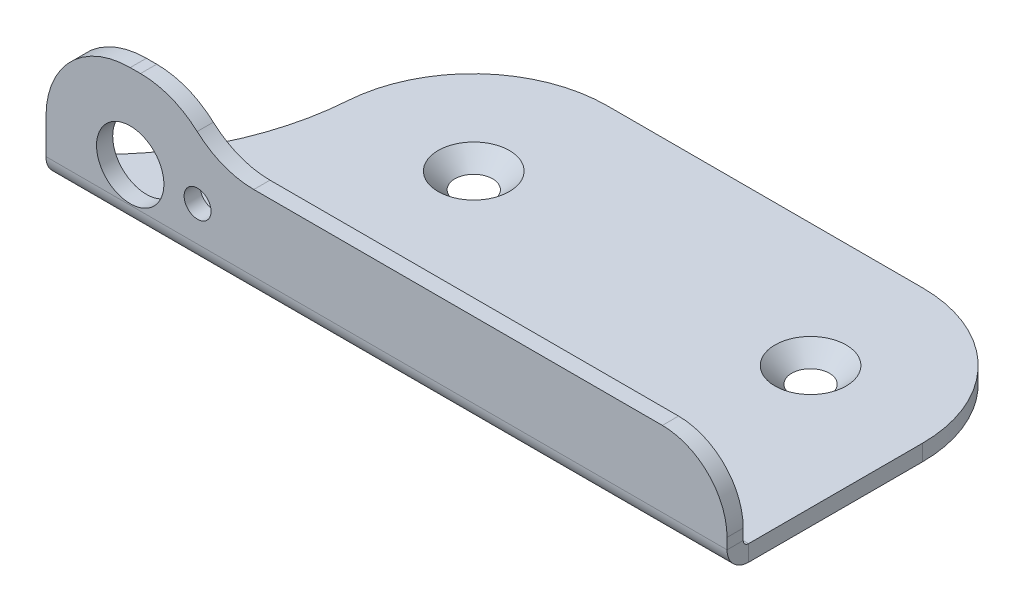
ISO-10303-21;
HEADER;
FILE_DESCRIPTION(('STEP AP214'),'2;1');
FILE_NAME('part.step','',(''),(''),'','','');
FILE_SCHEMA(('AUTOMOTIVE_DESIGN { 1 0 10303 214 1 1 1 1 }'));
ENDSEC;
DATA;
#1=APPLICATION_CONTEXT('core data for automotive mechanical design processes');
#2=APPLICATION_PROTOCOL_DEFINITION('international standard','automotive_design',2000,#1);
#3=PRODUCT_CONTEXT('',#1,'mechanical');
#4=PRODUCT('Part','Part','',(#3));
#5=PRODUCT_RELATED_PRODUCT_CATEGORY('part','',(#4));
#6=PRODUCT_DEFINITION_FORMATION('','',#4);
#7=PRODUCT_DEFINITION_CONTEXT('part definition',#1,'design');
#8=PRODUCT_DEFINITION('design','',#6,#7);
#9=PRODUCT_DEFINITION_SHAPE('','',#8);
#10=(LENGTH_UNIT() NAMED_UNIT(*) SI_UNIT(.MILLI.,.METRE.));
#11=(NAMED_UNIT(*) PLANE_ANGLE_UNIT() SI_UNIT($,.RADIAN.));
#12=(NAMED_UNIT(*) SI_UNIT($,.STERADIAN.) SOLID_ANGLE_UNIT());
#13=UNCERTAINTY_MEASURE_WITH_UNIT(LENGTH_MEASURE(1.E-05),#10,'distance_accuracy_value','');
#14=(GEOMETRIC_REPRESENTATION_CONTEXT(3) GLOBAL_UNCERTAINTY_ASSIGNED_CONTEXT((#13)) GLOBAL_UNIT_ASSIGNED_CONTEXT((#10,
#11,#12)) REPRESENTATION_CONTEXT('',''));
#15=CARTESIAN_POINT('',(0.,0.,0.));
#16=DIRECTION('',(0.,0.,1.));
#17=DIRECTION('',(1.,0.,0.));
#18=AXIS2_PLACEMENT_3D('',#15,#16,#17);
#19=CARTESIAN_POINT('',(-36.703,-1.524,19.4945));
#20=DIRECTION('',(-1.,0.,0.));
#21=DIRECTION('',(0.,1.,0.));
#22=AXIS2_PLACEMENT_3D('',#19,#20,#21);
#23=PLANE('',#22);
#24=CARTESIAN_POINT('',(-36.703,0.508,19.4945));
#25=CARTESIAN_POINT('',(-36.703,0.508,17.9705));
#26=B_SPLINE_CURVE_WITH_KNOTS('',1,(#24,#25),.UNSPECIFIED.,.F.,.F.,(2,2),(0.,1.),.UNSPECIFIED.);
#27=CARTESIAN_POINT('',(-36.703,0.508,17.9705));
#28=VERTEX_POINT('',#27);
#29=CARTESIAN_POINT('',(-36.703,0.507999999999999,19.4945));
#30=VERTEX_POINT('',#29);
#31=EDGE_CURVE('E11',#28,#30,#26,.F.);
#32=ORIENTED_EDGE('',*,*,#31,.T.);
#33=DIRECTION('',(0.,1.,0.));
#34=VECTOR('',#33,1.);
#35=CARTESIAN_POINT('',(-36.703,-1.524,19.4945));
#36=LINE('',#35,#34);
#37=CARTESIAN_POINT('',(-36.703,3.81,19.4945));
#38=VERTEX_POINT('',#37);
#39=EDGE_CURVE('E263',#30,#38,#36,.T.);
#40=ORIENTED_EDGE('',*,*,#39,.T.);
#41=DIRECTION('',(0.,0.,1.));
#42=VECTOR('',#41,1.);
#43=CARTESIAN_POINT('',(-36.703,3.81,19.4945));
#44=LINE('',#43,#42);
#45=CARTESIAN_POINT('',(-36.703,3.81,17.9705));
#46=VERTEX_POINT('',#45);
#47=EDGE_CURVE('E56',#46,#38,#44,.T.);
#48=ORIENTED_EDGE('',*,*,#47,.F.);
#49=DIRECTION('',(0.,1.,0.));
#50=VECTOR('',#49,1.);
#51=CARTESIAN_POINT('',(-36.703,-1.524,17.9705));
#52=LINE('',#51,#50);
#53=EDGE_CURVE('E128',#28,#46,#52,.T.);
#54=ORIENTED_EDGE('',*,*,#53,.F.);
#55=EDGE_LOOP('',(#32,#40,#48,#54));
#56=FACE_BOUND('',#55,.T.);
#57=ADVANCED_FACE('F45',(#56),#23,.T.);
#58=CARTESIAN_POINT('',(-28.7655,3.81,19.4945));
#59=DIRECTION('',(0.,0.,1.));
#60=DIRECTION('',(-1.,0.,0.));
#61=AXIS2_PLACEMENT_3D('',#58,#59,#60);
#62=CYLINDRICAL_SURFACE('',#61,7.9375);
#63=ORIENTED_EDGE('',*,*,#47,.T.);
#64=CARTESIAN_POINT('',(-28.7655,3.81,19.4945));
#65=DIRECTION('',(0.,0.,-1.));
#66=DIRECTION('',(-1.,0.,0.));
#67=AXIS2_PLACEMENT_3D('',#64,#65,#66);
#68=CIRCLE('',#67,7.9375);
#69=CARTESIAN_POINT('',(-28.7655,11.7475,19.4945));
#70=VERTEX_POINT('',#69);
#71=EDGE_CURVE('E260',#38,#70,#68,.T.);
#72=ORIENTED_EDGE('',*,*,#71,.T.);
#73=DIRECTION('',(0.,0.,1.));
#74=VECTOR('',#73,1.);
#75=CARTESIAN_POINT('',(-28.7655,11.7475,19.4945));
#76=LINE('',#75,#74);
#77=CARTESIAN_POINT('',(-28.7655,11.7475,17.9705));
#78=VERTEX_POINT('',#77);
#79=EDGE_CURVE('E246',#78,#70,#76,.T.);
#80=ORIENTED_EDGE('',*,*,#79,.F.);
#81=CARTESIAN_POINT('',(-28.7655,3.81,17.9705));
#82=DIRECTION('',(0.,0.,-1.));
#83=DIRECTION('',(-1.,0.,0.));
#84=AXIS2_PLACEMENT_3D('',#81,#82,#83);
#85=CIRCLE('',#84,7.9375);
#86=EDGE_CURVE('E159',#46,#78,#85,.T.);
#87=ORIENTED_EDGE('',*,*,#86,.F.);
#88=EDGE_LOOP('',(#63,#72,#80,#87));
#89=FACE_BOUND('',#88,.T.);
#90=ADVANCED_FACE('F258',(#89),#62,.T.);
#91=CARTESIAN_POINT('',(-36.703,11.7475,19.4945));
#92=DIRECTION('',(0.,-1.,0.));
#93=DIRECTION('',(-1.,0.,0.));
#94=AXIS2_PLACEMENT_3D('',#91,#92,#93);
#95=PLANE('',#94);
#96=ORIENTED_EDGE('',*,*,#79,.T.);
#97=DIRECTION('',(-1.,0.,0.));
#98=VECTOR('',#97,1.);
#99=CARTESIAN_POINT('',(-36.703,11.7475,19.4945));
#100=LINE('',#99,#98);
#101=CARTESIAN_POINT('',(-27.791318623329,11.7475,19.4945));
#102=VERTEX_POINT('',#101);
#103=EDGE_CURVE('E495',#102,#70,#100,.T.);
#104=ORIENTED_EDGE('',*,*,#103,.F.);
#105=DIRECTION('',(0.,0.,1.));
#106=VECTOR('',#105,1.);
#107=CARTESIAN_POINT('',(-27.791318623329,11.7475,19.4945));
#108=LINE('',#107,#106);
#109=CARTESIAN_POINT('',(-27.791318623329,11.7475,17.9705));
#110=VERTEX_POINT('',#109);
#111=EDGE_CURVE('E244',#110,#102,#108,.T.);
#112=ORIENTED_EDGE('',*,*,#111,.F.);
#113=DIRECTION('',(-1.,0.,0.));
#114=VECTOR('',#113,1.);
#115=CARTESIAN_POINT('',(27.4955,11.7475,17.9705));
#116=LINE('',#115,#114);
#117=EDGE_CURVE('E387',#110,#78,#116,.T.);
#118=ORIENTED_EDGE('',*,*,#117,.T.);
#119=EDGE_LOOP('',(#96,#104,#112,#118));
#120=FACE_BOUND('',#119,.T.);
#121=ADVANCED_FACE('F423',(#120),#95,.F.);
#122=CARTESIAN_POINT('',(-27.791318623329,3.81,19.4945));
#123=DIRECTION('',(0.,0.,1.));
#124=DIRECTION('',(-1.,0.,0.));
#125=AXIS2_PLACEMENT_3D('',#122,#123,#124);
#126=CYLINDRICAL_SURFACE('',#125,7.9375);
#127=ORIENTED_EDGE('',*,*,#111,.T.);
#128=CARTESIAN_POINT('',(-27.791318623329,3.81,19.4945));
#129=DIRECTION('',(0.,0.,-1.));
#130=DIRECTION('',(-1.,0.,0.));
#131=AXIS2_PLACEMENT_3D('',#128,#129,#130);
#132=CIRCLE('',#131,7.9375);
#133=CARTESIAN_POINT('',(-22.4525016019749,9.68375,19.4945));
#134=VERTEX_POINT('',#133);
#135=EDGE_CURVE('E503',#102,#134,#132,.T.);
#136=ORIENTED_EDGE('',*,*,#135,.T.);
#137=DIRECTION('',(0.,0.,1.));
#138=VECTOR('',#137,1.);
#139=CARTESIAN_POINT('',(-22.4525016019749,9.68375,19.4945));
#140=LINE('',#139,#138);
#141=CARTESIAN_POINT('',(-22.4525016019749,9.68374999999999,17.9705));
#142=VERTEX_POINT('',#141);
#143=EDGE_CURVE('E240',#142,#134,#140,.T.);
#144=ORIENTED_EDGE('',*,*,#143,.F.);
#145=CARTESIAN_POINT('',(-27.791318623329,3.81,17.9705));
#146=DIRECTION('',(0.,0.,-1.));
#147=DIRECTION('',(-1.,0.,0.));
#148=AXIS2_PLACEMENT_3D('',#145,#146,#147);
#149=CIRCLE('',#148,7.9375);
#150=EDGE_CURVE('E383',#110,#142,#149,.T.);
#151=ORIENTED_EDGE('',*,*,#150,.F.);
#152=EDGE_LOOP('',(#127,#136,#144,#151));
#153=FACE_BOUND('',#152,.T.);
#154=ADVANCED_FACE('F427',(#153),#126,.T.);
#155=CARTESIAN_POINT('',(-17.1136845806208,15.5575,19.4945));
#156=DIRECTION('',(0.,0.,1.));
#157=DIRECTION('',(-1.,0.,0.));
#158=AXIS2_PLACEMENT_3D('',#155,#156,#157);
#159=CYLINDRICAL_SURFACE('',#158,7.9375);
#160=ORIENTED_EDGE('',*,*,#143,.T.);
#161=CARTESIAN_POINT('',(-17.1136845806208,15.5575,19.4945));
#162=DIRECTION('',(0.,0.,-1.));
#163=DIRECTION('',(-1.,0.,0.));
#164=AXIS2_PLACEMENT_3D('',#161,#162,#163);
#165=CIRCLE('',#164,7.9375);
#166=CARTESIAN_POINT('',(-17.1136845806208,7.62,19.4945));
#167=VERTEX_POINT('',#166);
#168=EDGE_CURVE('E344',#134,#167,#165,.F.);
#169=ORIENTED_EDGE('',*,*,#168,.T.);
#170=DIRECTION('',(0.,0.,1.));
#171=VECTOR('',#170,1.);
#172=CARTESIAN_POINT('',(-17.1136845806208,7.62,19.4945));
#173=LINE('',#172,#171);
#174=CARTESIAN_POINT('',(-17.1136845806208,7.62,17.9705));
#175=VERTEX_POINT('',#174);
#176=EDGE_CURVE('E236',#175,#167,#173,.T.);
#177=ORIENTED_EDGE('',*,*,#176,.F.);
#178=CARTESIAN_POINT('',(-17.1136845806208,15.5575,17.9705));
#179=DIRECTION('',(0.,0.,-1.));
#180=DIRECTION('',(-1.,0.,0.));
#181=AXIS2_PLACEMENT_3D('',#178,#179,#180);
#182=CIRCLE('',#181,7.9375);
#183=EDGE_CURVE('E379',#142,#175,#182,.F.);
#184=ORIENTED_EDGE('',*,*,#183,.F.);
#185=EDGE_LOOP('',(#160,#169,#177,#184));
#186=FACE_BOUND('',#185,.T.);
#187=ADVANCED_FACE('F432',(#186),#159,.F.);
#188=CARTESIAN_POINT('',(27.4955,7.62,19.4945));
#189=DIRECTION('',(0.,-1.,0.));
#190=DIRECTION('',(-1.,0.,0.));
#191=AXIS2_PLACEMENT_3D('',#188,#189,#190);
#192=PLANE('',#191);
#193=ORIENTED_EDGE('',*,*,#176,.T.);
#194=DIRECTION('',(-1.,0.,0.));
#195=VECTOR('',#194,1.);
#196=CARTESIAN_POINT('',(27.4955,7.62,19.4945));
#197=LINE('',#196,#195);
#198=CARTESIAN_POINT('',(21.3995,7.62,19.4945));
#199=VERTEX_POINT('',#198);
#200=EDGE_CURVE('E341',#199,#167,#197,.T.);
#201=ORIENTED_EDGE('',*,*,#200,.F.);
#202=DIRECTION('',(0.,0.,1.));
#203=VECTOR('',#202,1.);
#204=CARTESIAN_POINT('',(21.3995,7.62,19.4945));
#205=LINE('',#204,#203);
#206=CARTESIAN_POINT('',(21.3995,7.62,17.9705));
#207=VERTEX_POINT('',#206);
#208=EDGE_CURVE('E233',#207,#199,#205,.T.);
#209=ORIENTED_EDGE('',*,*,#208,.F.);
#210=DIRECTION('',(-1.,0.,0.));
#211=VECTOR('',#210,1.);
#212=CARTESIAN_POINT('',(27.4955,7.62,17.9705));
#213=LINE('',#212,#211);
#214=EDGE_CURVE('E376',#207,#175,#213,.T.);
#215=ORIENTED_EDGE('',*,*,#214,.T.);
#216=EDGE_LOOP('',(#193,#201,#209,#215));
#217=FACE_BOUND('',#216,.T.);
#218=ADVANCED_FACE('F436',(#217),#192,.F.);
#219=CARTESIAN_POINT('',(21.3995,1.524,19.4945));
#220=DIRECTION('',(0.,0.,1.));
#221=DIRECTION('',(-1.,0.,0.));
#222=AXIS2_PLACEMENT_3D('',#219,#220,#221);
#223=CYLINDRICAL_SURFACE('',#222,6.096);
#224=ORIENTED_EDGE('',*,*,#208,.T.);
#225=CARTESIAN_POINT('',(21.3995,1.524,19.4945));
#226=DIRECTION('',(0.,0.,-1.));
#227=DIRECTION('',(-1.,0.,0.));
#228=AXIS2_PLACEMENT_3D('',#225,#226,#227);
#229=CIRCLE('',#228,6.096);
#230=CARTESIAN_POINT('',(27.4955,1.524,19.4945));
#231=VERTEX_POINT('',#230);
#232=EDGE_CURVE('E273',#199,#231,#229,.T.);
#233=ORIENTED_EDGE('',*,*,#232,.T.);
#234=DIRECTION('',(0.,0.,1.));
#235=VECTOR('',#234,1.);
#236=CARTESIAN_POINT('',(27.4955,1.524,19.4945));
#237=LINE('',#236,#235);
#238=CARTESIAN_POINT('',(27.4955,1.524,17.9705));
#239=VERTEX_POINT('',#238);
#240=EDGE_CURVE('E230',#239,#231,#237,.T.);
#241=ORIENTED_EDGE('',*,*,#240,.F.);
#242=CARTESIAN_POINT('',(21.3995,1.524,17.9705));
#243=DIRECTION('',(0.,0.,-1.));
#244=DIRECTION('',(-1.,0.,0.));
#245=AXIS2_PLACEMENT_3D('',#242,#243,#244);
#246=CIRCLE('',#245,6.096);
#247=EDGE_CURVE('E374',#207,#239,#246,.T.);
#248=ORIENTED_EDGE('',*,*,#247,.F.);
#249=EDGE_LOOP('',(#224,#233,#241,#248));
#250=FACE_BOUND('',#249,.T.);
#251=ADVANCED_FACE('F338',(#250),#223,.T.);
#252=CARTESIAN_POINT('',(27.4955,-1.524,19.4945));
#253=DIRECTION('',(-1.,0.,0.));
#254=DIRECTION('',(0.,1.,0.));
#255=AXIS2_PLACEMENT_3D('',#252,#253,#254);
#256=PLANE('',#255);
#257=ORIENTED_EDGE('',*,*,#240,.T.);
#258=DIRECTION('',(0.,1.,0.));
#259=VECTOR('',#258,1.);
#260=CARTESIAN_POINT('',(27.4955,-1.524,19.4945));
#261=LINE('',#260,#259);
#262=CARTESIAN_POINT('',(27.4955,0.507999999999999,19.4945));
#263=VERTEX_POINT('',#262);
#264=EDGE_CURVE('E267',#263,#231,#261,.T.);
#265=ORIENTED_EDGE('',*,*,#264,.F.);
#266=DIRECTION('',(0.,0.,1.));
#267=VECTOR('',#266,1.);
#268=CARTESIAN_POINT('',(27.4955,0.507999999999999,19.4945));
#269=LINE('',#268,#267);
#270=CARTESIAN_POINT('',(27.4955,0.507999999999998,17.9705));
#271=VERTEX_POINT('',#270);
#272=EDGE_CURVE('E227',#271,#263,#269,.T.);
#273=ORIENTED_EDGE('',*,*,#272,.F.);
#274=DIRECTION('',(0.,1.,0.));
#275=VECTOR('',#274,1.);
#276=CARTESIAN_POINT('',(27.4955,-1.524,17.9705));
#277=LINE('',#276,#275);
#278=EDGE_CURVE('E131',#271,#239,#277,.T.);
#279=ORIENTED_EDGE('',*,*,#278,.T.);
#280=EDGE_LOOP('',(#257,#265,#273,#279));
#281=FACE_BOUND('',#280,.T.);
#282=ADVANCED_FACE('F336',(#281),#256,.F.);
#283=CARTESIAN_POINT('',(27.4955,0.508,17.4625));
#284=DIRECTION('',(-1.,0.,0.));
#285=DIRECTION('',(0.,0.,-1.));
#286=AXIS2_PLACEMENT_3D('',#283,#284,#285);
#287=PLANE('',#286);
#288=ORIENTED_EDGE('',*,*,#272,.T.);
#289=CARTESIAN_POINT('',(27.4955,0.508,17.4625));
#290=DIRECTION('',(-1.,0.,0.));
#291=DIRECTION('',(0.,0.,1.));
#292=AXIS2_PLACEMENT_3D('',#289,#290,#291);
#293=CIRCLE('',#292,2.032);
#294=CARTESIAN_POINT('',(27.4955,-1.524,17.4625));
#295=VERTEX_POINT('',#294);
#296=EDGE_CURVE('E326',#263,#295,#293,.F.);
#297=ORIENTED_EDGE('',*,*,#296,.T.);
#298=DIRECTION('',(0.,-1.,0.));
#299=VECTOR('',#298,1.);
#300=CARTESIAN_POINT('',(27.4955,-1.524,17.4625));
#301=LINE('',#300,#299);
#302=CARTESIAN_POINT('',(27.4955,0.,17.4625));
#303=VERTEX_POINT('',#302);
#304=EDGE_CURVE('E224',#303,#295,#301,.T.);
#305=ORIENTED_EDGE('',*,*,#304,.F.);
#306=CARTESIAN_POINT('',(27.4955,0.508,17.4625));
#307=DIRECTION('',(-1.,0.,0.));
#308=DIRECTION('',(0.,0.,1.));
#309=AXIS2_PLACEMENT_3D('',#306,#307,#308);
#310=CIRCLE('',#309,0.508);
#311=EDGE_CURVE('E151',#271,#303,#310,.F.);
#312=ORIENTED_EDGE('',*,*,#311,.F.);
#313=EDGE_LOOP('',(#288,#297,#305,#312));
#314=FACE_BOUND('',#313,.T.);
#315=ADVANCED_FACE('F445',(#314),#287,.F.);
#316=CARTESIAN_POINT('',(27.4955,-1.524,-11.6205));
#317=DIRECTION('',(1.,0.,0.));
#318=DIRECTION('',(0.,0.,1.));
#319=AXIS2_PLACEMENT_3D('',#316,#317,#318);
#320=PLANE('',#319);
#321=ORIENTED_EDGE('',*,*,#304,.T.);
#322=DIRECTION('',(0.,0.,1.));
#323=VECTOR('',#322,1.);
#324=CARTESIAN_POINT('',(27.4955,-1.524,-11.6205));
#325=LINE('',#324,#323);
#326=CARTESIAN_POINT('',(27.4955,-1.524,1.0795));
#327=VERTEX_POINT('',#326);
#328=EDGE_CURVE('E270',#327,#295,#325,.T.);
#329=ORIENTED_EDGE('',*,*,#328,.F.);
#330=DIRECTION('',(0.,-1.,0.));
#331=VECTOR('',#330,1.);
#332=CARTESIAN_POINT('',(27.4955,-1.524,1.0795));
#333=LINE('',#332,#331);
#334=CARTESIAN_POINT('',(27.4955,0.,1.0795));
#335=VERTEX_POINT('',#334);
#336=EDGE_CURVE('E221',#335,#327,#333,.T.);
#337=ORIENTED_EDGE('',*,*,#336,.F.);
#338=DIRECTION('',(0.,0.,-1.));
#339=VECTOR('',#338,1.);
#340=CARTESIAN_POINT('',(27.4955,0.,0.));
#341=LINE('',#340,#339);
#342=EDGE_CURVE('E368',#335,#303,#341,.F.);
#343=ORIENTED_EDGE('',*,*,#342,.T.);
#344=EDGE_LOOP('',(#321,#329,#337,#343));
#345=FACE_BOUND('',#344,.T.);
#346=ADVANCED_FACE('F448',(#345),#320,.T.);
#347=CARTESIAN_POINT('',(14.7955,-1.524,1.0795));
#348=DIRECTION('',(0.,1.,0.));
#349=DIRECTION('',(0.,0.,-1.));
#350=AXIS2_PLACEMENT_3D('',#347,#348,#349);
#351=CYLINDRICAL_SURFACE('',#350,12.7);
#352=ORIENTED_EDGE('',*,*,#336,.T.);
#353=CARTESIAN_POINT('',(14.7955,-1.524,1.0795));
#354=DIRECTION('',(0.,-1.,0.));
#355=DIRECTION('',(0.,0.,-1.));
#356=AXIS2_PLACEMENT_3D('',#353,#354,#355);
#357=CIRCLE('',#356,12.7);
#358=CARTESIAN_POINT('',(14.7955,-1.524,-11.6205));
#359=VERTEX_POINT('',#358);
#360=EDGE_CURVE('E349',#327,#359,#357,.F.);
#361=ORIENTED_EDGE('',*,*,#360,.T.);
#362=DIRECTION('',(0.,-1.,0.));
#363=VECTOR('',#362,1.);
#364=CARTESIAN_POINT('',(14.7955,-1.524,-11.6205));
#365=LINE('',#364,#363);
#366=CARTESIAN_POINT('',(14.7955,0.,-11.6205));
#367=VERTEX_POINT('',#366);
#368=EDGE_CURVE('E218',#367,#359,#365,.T.);
#369=ORIENTED_EDGE('',*,*,#368,.F.);
#370=CARTESIAN_POINT('',(14.7955,0.,1.0795));
#371=DIRECTION('',(0.,-1.,0.));
#372=DIRECTION('',(0.,0.,-1.));
#373=AXIS2_PLACEMENT_3D('',#370,#371,#372);
#374=CIRCLE('',#373,12.7);
#375=EDGE_CURVE('E365',#335,#367,#374,.F.);
#376=ORIENTED_EDGE('',*,*,#375,.F.);
#377=EDGE_LOOP('',(#352,#361,#369,#376));
#378=FACE_BOUND('',#377,.T.);
#379=ADVANCED_FACE('F452',(#378),#351,.T.);
#380=CARTESIAN_POINT('',(-27.4955,-1.524,-11.6205));
#381=DIRECTION('',(0.,0.,-1.));
#382=DIRECTION('',(1.,0.,0.));
#383=AXIS2_PLACEMENT_3D('',#380,#381,#382);
#384=PLANE('',#383);
#385=ORIENTED_EDGE('',*,*,#368,.T.);
#386=DIRECTION('',(1.,0.,0.));
#387=VECTOR('',#386,1.);
#388=CARTESIAN_POINT('',(-27.4955,-1.524,-11.6205));
#389=LINE('',#388,#387);
#390=CARTESIAN_POINT('',(-14.8897640593582,-1.524,-11.6205));
#391=VERTEX_POINT('',#390);
#392=EDGE_CURVE('E352',#391,#359,#389,.T.);
#393=ORIENTED_EDGE('',*,*,#392,.F.);
#394=DIRECTION('',(0.,-1.,0.));
#395=VECTOR('',#394,1.);
#396=CARTESIAN_POINT('',(-14.8897640593582,-1.524,-11.6205));
#397=LINE('',#396,#395);
#398=CARTESIAN_POINT('',(-14.8897640593582,0.,-11.6205));
#399=VERTEX_POINT('',#398);
#400=EDGE_CURVE('E213',#399,#391,#397,.T.);
#401=ORIENTED_EDGE('',*,*,#400,.F.);
#402=DIRECTION('',(1.,0.,0.));
#403=VECTOR('',#402,1.);
#404=CARTESIAN_POINT('',(0.,0.,-11.6205));
#405=LINE('',#404,#403);
#406=EDGE_CURVE('E363',#399,#367,#405,.T.);
#407=ORIENTED_EDGE('',*,*,#406,.T.);
#408=EDGE_LOOP('',(#385,#393,#401,#407));
#409=FACE_BOUND('',#408,.T.);
#410=ADVANCED_FACE('F456',(#409),#384,.T.);
#411=CARTESIAN_POINT('',(-14.8897640593582,-1.524,1.0795));
#412=DIRECTION('',(0.,1.,0.));
#413=DIRECTION('',(0.,0.,-1.));
#414=AXIS2_PLACEMENT_3D('',#411,#412,#413);
#415=CYLINDRICAL_SURFACE('',#414,12.7);
#416=ORIENTED_EDGE('',*,*,#400,.T.);
#417=CARTESIAN_POINT('',(-14.8897640593582,-1.524,1.0795));
#418=DIRECTION('',(0.,-1.,0.));
#419=DIRECTION('',(0.,0.,-1.));
#420=AXIS2_PLACEMENT_3D('',#417,#418,#419);
#421=CIRCLE('',#420,12.7);
#422=CARTESIAN_POINT('',(-27.5583427062388,-1.524,0.18668699169386));
#423=VERTEX_POINT('',#422);
#424=EDGE_CURVE('E294',#391,#423,#421,.F.);
#425=ORIENTED_EDGE('',*,*,#424,.T.);
#426=DIRECTION('',(0.,-1.,0.));
#427=VECTOR('',#426,1.);
#428=CARTESIAN_POINT('',(-27.5583427062388,-1.524,0.18668699169386));
#429=LINE('',#428,#427);
#430=CARTESIAN_POINT('',(-27.5583427062388,0.,0.18668699169386));
#431=VERTEX_POINT('',#430);
#432=EDGE_CURVE('E204',#431,#423,#429,.T.);
#433=ORIENTED_EDGE('',*,*,#432,.F.);
#434=CARTESIAN_POINT('',(-14.8897640593582,0.,1.0795));
#435=DIRECTION('',(0.,-1.,0.));
#436=DIRECTION('',(0.,0.,-1.));
#437=AXIS2_PLACEMENT_3D('',#434,#435,#436);
#438=CIRCLE('',#437,12.7);
#439=EDGE_CURVE('E359',#399,#431,#438,.F.);
#440=ORIENTED_EDGE('',*,*,#439,.F.);
#441=EDGE_LOOP('',(#416,#425,#433,#440));
#442=FACE_BOUND('',#441,.T.);
#443=ADVANCED_FACE('F460',(#442),#415,.T.);
#444=CARTESIAN_POINT('',(-52.8955,-1.524,-1.59893902491843));
#445=DIRECTION('',(0.,1.,0.));
#446=DIRECTION('',(0.,0.,-1.));
#447=AXIS2_PLACEMENT_3D('',#444,#445,#446);
#448=CYLINDRICAL_SURFACE('',#447,25.4);
#449=ORIENTED_EDGE('',*,*,#432,.T.);
#450=CARTESIAN_POINT('',(-52.8955,-1.524,-1.59893902491843));
#451=DIRECTION('',(0.,-1.,0.));
#452=DIRECTION('',(0.,0.,-1.));
#453=AXIS2_PLACEMENT_3D('',#450,#451,#452);
#454=CIRCLE('',#453,25.4);
#455=CARTESIAN_POINT('',(-36.1079587178671,-1.524,17.4625));
#456=VERTEX_POINT('',#455);
#457=EDGE_CURVE('E287',#423,#456,#454,.T.);
#458=ORIENTED_EDGE('',*,*,#457,.T.);
#459=CARTESIAN_POINT('',(-36.1079587178671,0.,17.4625));
#460=CARTESIAN_POINT('',(-36.1079587178671,-1.524,17.4625));
#461=B_SPLINE_CURVE_WITH_KNOTS('',1,(#459,#460),.UNSPECIFIED.,.F.,.F.,(2,2),(0.,1.),.UNSPECIFIED.);
#462=CARTESIAN_POINT('',(-36.1079587178671,0.,17.4625));
#463=VERTEX_POINT('',#462);
#464=EDGE_CURVE('E214',#463,#456,#461,.T.);
#465=ORIENTED_EDGE('',*,*,#464,.F.);
#466=CARTESIAN_POINT('',(-52.8955,0.,-1.59893902491843));
#467=DIRECTION('',(0.,-1.,0.));
#468=DIRECTION('',(0.,0.,-1.));
#469=AXIS2_PLACEMENT_3D('',#466,#467,#468);
#470=CIRCLE('',#469,25.4);
#471=EDGE_CURVE('E138',#431,#463,#470,.T.);
#472=ORIENTED_EDGE('',*,*,#471,.F.);
#473=EDGE_LOOP('',(#449,#458,#465,#472));
#474=FACE_BOUND('',#473,.T.);
#475=ADVANCED_FACE('F308',(#474),#448,.F.);
#476=CARTESIAN_POINT('',(-28.7655,3.81,19.4945));
#477=DIRECTION('',(0.,0.,1.));
#478=DIRECTION('',(-1.,0.,0.));
#479=AXIS2_PLACEMENT_3D('',#476,#477,#478);
#480=CYLINDRICAL_SURFACE('',#479,3.175);
#481=CARTESIAN_POINT('',(-28.7655,3.81,19.4945));
#482=DIRECTION('',(0.,0.,-1.));
#483=DIRECTION('',(-1.,0.,0.));
#484=AXIS2_PLACEMENT_3D('',#481,#482,#483);
#485=CIRCLE('',#484,3.175);
#486=CARTESIAN_POINT('',(-31.9405,3.81,19.4945));
#487=VERTEX_POINT('',#486);
#488=EDGE_CURVE('E358',#487,#487,#485,.T.);
#489=CARTESIAN_POINT('',(-28.7655,3.81,17.9705));
#490=DIRECTION('',(0.,0.,-1.));
#491=DIRECTION('',(-1.,0.,0.));
#492=AXIS2_PLACEMENT_3D('',#489,#490,#491);
#493=CIRCLE('',#492,3.175);
#494=CARTESIAN_POINT('',(-31.9405,3.81,17.9705));
#495=VERTEX_POINT('',#494);
#496=EDGE_CURVE('E372',#495,#495,#493,.T.);
#497=CARTESIAN_POINT('',(-31.9405,3.81,19.4945));
#498=CARTESIAN_POINT('',(-31.9405,3.81,19.478625));
#499=CARTESIAN_POINT('',(-31.9405,3.81,19.46275));
#500=CARTESIAN_POINT('',(-31.9405,3.81,19.431));
#501=CARTESIAN_POINT('',(-31.9405,3.81,19.415125));
#502=CARTESIAN_POINT('',(-31.9405,3.81,19.383375));
#503=CARTESIAN_POINT('',(-31.9405,3.81,19.3675));
#504=CARTESIAN_POINT('',(-31.9405,3.81,19.33575));
#505=CARTESIAN_POINT('',(-31.9405,3.81,19.319875));
#506=CARTESIAN_POINT('',(-31.9405,3.81,19.288125));
#507=CARTESIAN_POINT('',(-31.9405,3.81,19.27225));
#508=CARTESIAN_POINT('',(-31.9405,3.81,19.2405));
#509=CARTESIAN_POINT('',(-31.9405,3.81,19.224625));
#510=CARTESIAN_POINT('',(-31.9405,3.81,19.192875));
#511=CARTESIAN_POINT('',(-31.9405,3.81,19.177));
#512=CARTESIAN_POINT('',(-31.9405,3.81,19.14525));
#513=CARTESIAN_POINT('',(-31.9405,3.81,19.129375));
#514=CARTESIAN_POINT('',(-31.9405,3.81,19.097625));
#515=CARTESIAN_POINT('',(-31.9405,3.81,19.08175));
#516=CARTESIAN_POINT('',(-31.9405,3.81,19.05));
#517=CARTESIAN_POINT('',(-31.9405,3.81,19.034125));
#518=CARTESIAN_POINT('',(-31.9405,3.81,19.002375));
#519=CARTESIAN_POINT('',(-31.9405,3.81,18.9865));
#520=CARTESIAN_POINT('',(-31.9405,3.81,18.95475));
#521=CARTESIAN_POINT('',(-31.9405,3.81,18.938875));
#522=CARTESIAN_POINT('',(-31.9405,3.81,18.907125));
#523=CARTESIAN_POINT('',(-31.9405,3.81,18.89125));
#524=CARTESIAN_POINT('',(-31.9405,3.81,18.8595));
#525=CARTESIAN_POINT('',(-31.9405,3.81,18.843625));
#526=CARTESIAN_POINT('',(-31.9405,3.81,18.811875));
#527=CARTESIAN_POINT('',(-31.9405,3.81,18.796));
#528=CARTESIAN_POINT('',(-31.9405,3.81,18.76425));
#529=CARTESIAN_POINT('',(-31.9405,3.81,18.748375));
#530=CARTESIAN_POINT('',(-31.9405,3.81,18.716625));
#531=CARTESIAN_POINT('',(-31.9405,3.81,18.70075));
#532=CARTESIAN_POINT('',(-31.9405,3.81,18.669));
#533=CARTESIAN_POINT('',(-31.9405,3.81,18.653125));
#534=CARTESIAN_POINT('',(-31.9405,3.81,18.621375));
#535=CARTESIAN_POINT('',(-31.9405,3.81,18.6055));
#536=CARTESIAN_POINT('',(-31.9405,3.81,18.57375));
#537=CARTESIAN_POINT('',(-31.9405,3.81,18.557875));
#538=CARTESIAN_POINT('',(-31.9405,3.81,18.526125));
#539=CARTESIAN_POINT('',(-31.9405,3.81,18.51025));
#540=CARTESIAN_POINT('',(-31.9405,3.81,18.4785));
#541=CARTESIAN_POINT('',(-31.9405,3.81,18.462625));
#542=CARTESIAN_POINT('',(-31.9405,3.81,18.430875));
#543=CARTESIAN_POINT('',(-31.9405,3.81,18.415));
#544=CARTESIAN_POINT('',(-31.9405,3.81,18.38325));
#545=CARTESIAN_POINT('',(-31.9405,3.81,18.367375));
#546=CARTESIAN_POINT('',(-31.9405,3.81,18.335625));
#547=CARTESIAN_POINT('',(-31.9405,3.81,18.31975));
#548=CARTESIAN_POINT('',(-31.9405,3.81,18.288));
#549=CARTESIAN_POINT('',(-31.9405,3.81,18.272125));
#550=CARTESIAN_POINT('',(-31.9405,3.81,18.240375));
#551=CARTESIAN_POINT('',(-31.9405,3.81,18.2245));
#552=CARTESIAN_POINT('',(-31.9405,3.81,18.19275));
#553=CARTESIAN_POINT('',(-31.9405,3.81,18.176875));
#554=CARTESIAN_POINT('',(-31.9405,3.81,18.145125));
#555=CARTESIAN_POINT('',(-31.9405,3.81,18.12925));
#556=CARTESIAN_POINT('',(-31.9405,3.81,18.0975));
#557=CARTESIAN_POINT('',(-31.9405,3.81,18.081625));
#558=CARTESIAN_POINT('',(-31.9405,3.81,18.049875));
#559=CARTESIAN_POINT('',(-31.9405,3.81,18.034));
#560=CARTESIAN_POINT('',(-31.9405,3.81,18.00225));
#561=CARTESIAN_POINT('',(-31.9405,3.81,17.986375));
#562=CARTESIAN_POINT('',(-31.9405,3.81,17.9705));
#563=B_SPLINE_CURVE_WITH_KNOTS('',3,(#497,#498,#499,#500,#501,#502,#503,#504,#505,#506,#507,
#508,#509,#510,#511,#512,#513,#514,#515,#516,#517,#518,#519,#520,#521,#522,#523,#524,#525,#526,
#527,#528,#529,#530,#531,#532,#533,#534,#535,#536,#537,#538,#539,#540,#541,#542,#543,#544,#545,
#546,#547,#548,#549,#550,#551,#552,#553,#554,#555,#556,#557,#558,#559,#560,#561,#562),
.UNSPECIFIED.,.F.,.F.,(4,2,2,2,2,2,2,2,2,2,2,2,2,2,2,2,2,2,2,2,2,2,2,2,2,2,2,2,2,2,2,2,4),(0.,
0.0476249999999991,0.0952499999999981,0.142874999999997,0.1905,0.238124999999999,
0.285749999999998,0.333374999999997,0.380999999999999,0.428624999999998,0.476249999999998,
0.523875,0.571499999999999,0.619124999999998,0.666749999999997,0.714375,0.761999999999999,
0.809624999999998,0.85725,0.904874999999999,0.952499999999998,1.000125,1.04775,1.095375,1.143,
1.190625,1.23825,1.285875,1.3335,1.381125,1.42875,1.476375,1.524),.UNSPECIFIED.);
#564=EDGE_CURVE('BSEAM187',#487,#495,#563,.T.);
#565=ORIENTED_EDGE('',*,*,#488,.F.);
#566=ORIENTED_EDGE('',*,*,#496,.T.);
#567=ORIENTED_EDGE('',*,*,#564,.T.);
#568=ORIENTED_EDGE('',*,*,#564,.F.);
#569=EDGE_LOOP('',(#565,#567,#566,#568));
#570=FACE_BOUND('',#569,.T.);
#571=ADVANCED_FACE('F187',(#570),#480,.F.);
#572=CARTESIAN_POINT('',(-22.4155,3.81,19.4945));
#573=DIRECTION('',(0.,0.,1.));
#574=DIRECTION('',(-1.,0.,0.));
#575=AXIS2_PLACEMENT_3D('',#572,#573,#574);
#576=CYLINDRICAL_SURFACE('',#575,1.27);
#577=CARTESIAN_POINT('',(-22.4155,3.81,19.4945));
#578=DIRECTION('',(0.,0.,-1.));
#579=DIRECTION('',(-1.,0.,0.));
#580=AXIS2_PLACEMENT_3D('',#577,#578,#579);
#581=CIRCLE('',#580,1.27);
#582=CARTESIAN_POINT('',(-23.6855,3.81,19.4945));
#583=VERTEX_POINT('',#582);
#584=EDGE_CURVE('E492',#583,#583,#581,.T.);
#585=CARTESIAN_POINT('',(-22.4155,3.81,17.9705));
#586=DIRECTION('',(0.,0.,-1.));
#587=DIRECTION('',(-1.,0.,0.));
#588=AXIS2_PLACEMENT_3D('',#585,#586,#587);
#589=CIRCLE('',#588,1.27);
#590=CARTESIAN_POINT('',(-23.6855,3.81,17.9705));
#591=VERTEX_POINT('',#590);
#592=EDGE_CURVE('E389',#591,#591,#589,.T.);
#593=CARTESIAN_POINT('',(-23.6855,3.81,19.4945));
#594=CARTESIAN_POINT('',(-23.6855,3.81,19.478625));
#595=CARTESIAN_POINT('',(-23.6855,3.81,19.46275));
#596=CARTESIAN_POINT('',(-23.6855,3.81,19.431));
#597=CARTESIAN_POINT('',(-23.6855,3.81,19.415125));
#598=CARTESIAN_POINT('',(-23.6855,3.81,19.383375));
#599=CARTESIAN_POINT('',(-23.6855,3.81,19.3675));
#600=CARTESIAN_POINT('',(-23.6855,3.81,19.33575));
#601=CARTESIAN_POINT('',(-23.6855,3.81,19.319875));
#602=CARTESIAN_POINT('',(-23.6855,3.81,19.288125));
#603=CARTESIAN_POINT('',(-23.6855,3.81,19.27225));
#604=CARTESIAN_POINT('',(-23.6855,3.81,19.2405));
#605=CARTESIAN_POINT('',(-23.6855,3.81,19.224625));
#606=CARTESIAN_POINT('',(-23.6855,3.81,19.192875));
#607=CARTESIAN_POINT('',(-23.6855,3.81,19.177));
#608=CARTESIAN_POINT('',(-23.6855,3.81,19.14525));
#609=CARTESIAN_POINT('',(-23.6855,3.81,19.129375));
#610=CARTESIAN_POINT('',(-23.6855,3.81,19.097625));
#611=CARTESIAN_POINT('',(-23.6855,3.81,19.08175));
#612=CARTESIAN_POINT('',(-23.6855,3.81,19.05));
#613=CARTESIAN_POINT('',(-23.6855,3.81,19.034125));
#614=CARTESIAN_POINT('',(-23.6855,3.81,19.002375));
#615=CARTESIAN_POINT('',(-23.6855,3.81,18.9865));
#616=CARTESIAN_POINT('',(-23.6855,3.81,18.95475));
#617=CARTESIAN_POINT('',(-23.6855,3.81,18.938875));
#618=CARTESIAN_POINT('',(-23.6855,3.81,18.907125));
#619=CARTESIAN_POINT('',(-23.6855,3.81,18.89125));
#620=CARTESIAN_POINT('',(-23.6855,3.81,18.8595));
#621=CARTESIAN_POINT('',(-23.6855,3.81,18.843625));
#622=CARTESIAN_POINT('',(-23.6855,3.81,18.811875));
#623=CARTESIAN_POINT('',(-23.6855,3.81,18.796));
#624=CARTESIAN_POINT('',(-23.6855,3.81,18.76425));
#625=CARTESIAN_POINT('',(-23.6855,3.81,18.748375));
#626=CARTESIAN_POINT('',(-23.6855,3.81,18.716625));
#627=CARTESIAN_POINT('',(-23.6855,3.81,18.70075));
#628=CARTESIAN_POINT('',(-23.6855,3.81,18.669));
#629=CARTESIAN_POINT('',(-23.6855,3.81,18.653125));
#630=CARTESIAN_POINT('',(-23.6855,3.81,18.621375));
#631=CARTESIAN_POINT('',(-23.6855,3.81,18.6055));
#632=CARTESIAN_POINT('',(-23.6855,3.81,18.57375));
#633=CARTESIAN_POINT('',(-23.6855,3.81,18.557875));
#634=CARTESIAN_POINT('',(-23.6855,3.81,18.526125));
#635=CARTESIAN_POINT('',(-23.6855,3.81,18.51025));
#636=CARTESIAN_POINT('',(-23.6855,3.81,18.4785));
#637=CARTESIAN_POINT('',(-23.6855,3.81,18.462625));
#638=CARTESIAN_POINT('',(-23.6855,3.81,18.430875));
#639=CARTESIAN_POINT('',(-23.6855,3.81,18.415));
#640=CARTESIAN_POINT('',(-23.6855,3.81,18.38325));
#641=CARTESIAN_POINT('',(-23.6855,3.81,18.367375));
#642=CARTESIAN_POINT('',(-23.6855,3.81,18.335625));
#643=CARTESIAN_POINT('',(-23.6855,3.81,18.31975));
#644=CARTESIAN_POINT('',(-23.6855,3.81,18.288));
#645=CARTESIAN_POINT('',(-23.6855,3.81,18.272125));
#646=CARTESIAN_POINT('',(-23.6855,3.81,18.240375));
#647=CARTESIAN_POINT('',(-23.6855,3.81,18.2245));
#648=CARTESIAN_POINT('',(-23.6855,3.81,18.19275));
#649=CARTESIAN_POINT('',(-23.6855,3.81,18.176875));
#650=CARTESIAN_POINT('',(-23.6855,3.81,18.145125));
#651=CARTESIAN_POINT('',(-23.6855,3.81,18.12925));
#652=CARTESIAN_POINT('',(-23.6855,3.81,18.0975));
#653=CARTESIAN_POINT('',(-23.6855,3.81,18.081625));
#654=CARTESIAN_POINT('',(-23.6855,3.81,18.049875));
#655=CARTESIAN_POINT('',(-23.6855,3.81,18.034));
#656=CARTESIAN_POINT('',(-23.6855,3.81,18.00225));
#657=CARTESIAN_POINT('',(-23.6855,3.81,17.986375));
#658=CARTESIAN_POINT('',(-23.6855,3.81,17.9705));
#659=B_SPLINE_CURVE_WITH_KNOTS('',3,(#593,#594,#595,#596,#597,#598,#599,#600,#601,#602,#603,
#604,#605,#606,#607,#608,#609,#610,#611,#612,#613,#614,#615,#616,#617,#618,#619,#620,#621,#622,
#623,#624,#625,#626,#627,#628,#629,#630,#631,#632,#633,#634,#635,#636,#637,#638,#639,#640,#641,
#642,#643,#644,#645,#646,#647,#648,#649,#650,#651,#652,#653,#654,#655,#656,#657,#658),
.UNSPECIFIED.,.F.,.F.,(4,2,2,2,2,2,2,2,2,2,2,2,2,2,2,2,2,2,2,2,2,2,2,2,2,2,2,2,2,2,2,2,4),(0.,
0.0476249999999991,0.0952499999999981,0.142874999999997,0.1905,0.238124999999999,
0.285749999999998,0.333374999999997,0.380999999999999,0.428624999999998,0.476249999999998,
0.523875,0.571499999999999,0.619124999999998,0.666749999999997,0.714375,0.761999999999999,
0.809624999999998,0.85725,0.904874999999999,0.952499999999998,1.000125,1.04775,1.095375,1.143,
1.190625,1.23825,1.285875,1.3335,1.381125,1.42875,1.476375,1.524),.UNSPECIFIED.);
#660=EDGE_CURVE('BSEAM47',#583,#591,#659,.T.);
#661=ORIENTED_EDGE('',*,*,#584,.F.);
#662=ORIENTED_EDGE('',*,*,#592,.T.);
#663=ORIENTED_EDGE('',*,*,#660,.T.);
#664=ORIENTED_EDGE('',*,*,#660,.F.);
#665=EDGE_LOOP('',(#661,#663,#662,#664));
#666=FACE_BOUND('',#665,.T.);
#667=ADVANCED_FACE('F47',(#666),#576,.F.);
#668=CARTESIAN_POINT('',(-36.703,0.508,19.4945));
#669=CARTESIAN_POINT('',(-36.703,0.263946267218355,19.4945));
#670=CARTESIAN_POINT('',(-36.7116912310045,-0.0194885855769778,19.4468279613967));
#671=CARTESIAN_POINT('',(-36.714041009088,-0.425824044741715,19.2732156237344));
#672=CARTESIAN_POINT('',(-36.7130430903786,-0.557929923451421,19.1990494530092));
#673=CARTESIAN_POINT('',(-36.703530910997,-0.80282153232603,19.022486382904));
#674=CARTESIAN_POINT('',(-36.6950166503248,-0.915517081592554,18.9201488426343));
#675=CARTESIAN_POINT('',(-36.666517801196,-1.11257617910135,18.6973578370599));
#676=CARTESIAN_POINT('',(-36.6465332127394,-1.19689782635311,18.5770008497435));
#677=CARTESIAN_POINT('',(-36.59113972222,-1.33413595363821,18.3315937065105));
#678=CARTESIAN_POINT('',(-36.5557308201573,-1.38707231281079,18.206638648768));
#679=CARTESIAN_POINT('',(-36.4204366648273,-1.50360847738597,17.8452857510388));
#680=CARTESIAN_POINT('',(-36.2911109531924,-1.524,17.623803441331));
#681=CARTESIAN_POINT('',(-36.1079587178671,-1.524,17.4625));
#682=CARTESIAN_POINT('',(-36.703,0.508,17.9705));
#683=CARTESIAN_POINT('',(-36.703,0.446986566804589,17.9705));
#684=CARTESIAN_POINT('',(-36.7116912310045,0.376127853605755,17.9585819903492));
#685=CARTESIAN_POINT('',(-36.714041009088,0.274543988814571,17.9151789059336));
#686=CARTESIAN_POINT('',(-36.7130430903786,0.241517519137144,17.8966373632523));
#687=CARTESIAN_POINT('',(-36.703530910997,0.180294616918492,17.852496595726));
#688=CARTESIAN_POINT('',(-36.6950166503248,0.152120729601862,17.8269122106586));
#689=CARTESIAN_POINT('',(-36.666517801196,0.102855955224662,17.771214459265));
#690=CARTESIAN_POINT('',(-36.6465332127394,0.0817755434117239,17.7411252124359));
#691=CARTESIAN_POINT('',(-36.59113972222,0.0474660115904484,17.6797734266276));
#692=CARTESIAN_POINT('',(-36.5557308201573,0.0342319217973022,17.648534662192));
#693=CARTESIAN_POINT('',(-36.4204366648273,0.00509788065350679,17.5581964377597));
#694=CARTESIAN_POINT('',(-36.291444480666,0.,17.5028992953214));
#695=CARTESIAN_POINT('',(-36.1079587178671,0.,17.4625));
#696=B_SPLINE_SURFACE_WITH_KNOTS('',1,3,((#668,#669,#670,#671,#672,#673,#674,#675,#676,#677,
#678,#679,#680,#681),(#682,#683,#684,#685,#686,#687,#688,#689,#690,#691,#692,#693,#694,#695)),
.UNSPECIFIED.,.F.,.F.,.F.,(2,2),(4,2,2,2,2,2,4),(0.,1.),(0.,0.25,0.375,0.5,0.625,0.75,1.),.UNSPECIFIED.);
#697=CARTESIAN_POINT('',(-36.703,0.508,17.9705));
#698=CARTESIAN_POINT('',(-36.703,0.446986566804589,17.9705));
#699=CARTESIAN_POINT('',(-36.7116912310045,0.376127853605755,17.9585819903492));
#700=CARTESIAN_POINT('',(-36.714041009088,0.274543988814571,17.9151789059336));
#701=CARTESIAN_POINT('',(-36.7130430903786,0.241517519137144,17.8966373632523));
#702=CARTESIAN_POINT('',(-36.703530910997,0.180294616918492,17.852496595726));
#703=CARTESIAN_POINT('',(-36.6950166503248,0.152120729601862,17.8269122106586));
#704=CARTESIAN_POINT('',(-36.666517801196,0.102855955224662,17.771214459265));
#705=CARTESIAN_POINT('',(-36.6465332127394,0.0817755434117239,17.7411252124359));
#706=CARTESIAN_POINT('',(-36.59113972222,0.0474660115904484,17.6797734266276));
#707=CARTESIAN_POINT('',(-36.5557308201573,0.0342319217973022,17.648534662192));
#708=CARTESIAN_POINT('',(-36.4204366648273,0.00509788065350679,17.5581964377597));
#709=CARTESIAN_POINT('',(-36.291444480666,0.,17.5028992953214));
#710=CARTESIAN_POINT('',(-36.1079587178671,0.,17.4625));
#711=B_SPLINE_CURVE_WITH_KNOTS('',3,(#697,#698,#699,#700,#701,#702,#703,#704,#705,#706,#707,
#708,#709,#710),.UNSPECIFIED.,.F.,.F.,(4,2,2,2,2,2,4),(0.,0.25,0.375,0.5,0.625,0.75,1.),.UNSPECIFIED.);
#712=EDGE_CURVE('E142',#463,#28,#711,.F.);
#713=CARTESIAN_POINT('',(-36.1079587178671,-1.524,17.4625));
#714=CARTESIAN_POINT('',(-36.2911109531924,-1.524,17.623803441331));
#715=CARTESIAN_POINT('',(-36.4204366648273,-1.50360847738597,17.8452857510388));
#716=CARTESIAN_POINT('',(-36.5557308201573,-1.38707231281079,18.206638648768));
#717=CARTESIAN_POINT('',(-36.59113972222,-1.33413595363821,18.3315937065105));
#718=CARTESIAN_POINT('',(-36.6465332127394,-1.19689782635311,18.5770008497435));
#719=CARTESIAN_POINT('',(-36.666517801196,-1.11257617910135,18.6973578370599));
#720=CARTESIAN_POINT('',(-36.6950166503248,-0.915517081592554,18.9201488426343));
#721=CARTESIAN_POINT('',(-36.703530910997,-0.80282153232603,19.022486382904));
#722=CARTESIAN_POINT('',(-36.7130430903786,-0.557929923451421,19.1990494530092));
#723=CARTESIAN_POINT('',(-36.714041009088,-0.425824044741715,19.2732156237344));
#724=CARTESIAN_POINT('',(-36.7116912310045,-0.0194885855769778,19.4468279613967));
#725=CARTESIAN_POINT('',(-36.703,0.263946267218355,19.4945));
#726=CARTESIAN_POINT('',(-36.703,0.508,19.4945));
#727=B_SPLINE_CURVE_WITH_KNOTS('',3,(#713,#714,#715,#716,#717,#718,#719,#720,#721,#722,#723,
#724,#725,#726),.UNSPECIFIED.,.F.,.F.,(4,2,2,2,2,2,4),(0.,0.25,0.375,0.5,0.625,0.75,1.),.UNSPECIFIED.);
#728=EDGE_CURVE('E164',#456,#30,#727,.T.);
#729=ORIENTED_EDGE('',*,*,#712,.F.);
#730=ORIENTED_EDGE('',*,*,#464,.T.);
#731=ORIENTED_EDGE('',*,*,#728,.T.);
#732=ORIENTED_EDGE('',*,*,#31,.F.);
#733=EDGE_LOOP('',(#729,#730,#731,#732));
#734=FACE_BOUND('',#733,.T.);
#735=ADVANCED_FACE('F163',(#734),#696,.T.);
#736=CARTESIAN_POINT('',(0.,-1.524,0.));
#737=DIRECTION('',(0.,1.,0.));
#738=DIRECTION('',(0.,0.,-1.));
#739=AXIS2_PLACEMENT_3D('',#736,#737,#738);
#740=PLANE('',#739);
#741=CARTESIAN_POINT('',(15.875,-1.524,0.));
#742=DIRECTION('',(0.,1.,0.));
#743=DIRECTION('',(0.,0.,1.));
#744=AXIS2_PLACEMENT_3D('',#741,#742,#743);
#745=CIRCLE('',#744,1.778);
#746=CARTESIAN_POINT('',(15.875,-1.524,1.77799999999999));
#747=VERTEX_POINT('',#746);
#748=EDGE_CURVE('E498',#747,#747,#745,.T.);
#749=ORIENTED_EDGE('',*,*,#748,.T.);
#750=EDGE_LOOP('',(#749));
#751=FACE_BOUND('',#750,.T.);
#752=CARTESIAN_POINT('',(-15.875,-1.524,0.));
#753=DIRECTION('',(0.,1.,0.));
#754=DIRECTION('',(0.,0.,1.));
#755=AXIS2_PLACEMENT_3D('',#752,#753,#754);
#756=CIRCLE('',#755,1.778);
#757=CARTESIAN_POINT('',(-15.875,-1.524,1.778));
#758=VERTEX_POINT('',#757);
#759=EDGE_CURVE('E569',#758,#758,#756,.T.);
#760=ORIENTED_EDGE('',*,*,#759,.T.);
#761=EDGE_LOOP('',(#760));
#762=FACE_BOUND('',#761,.T.);
#763=ORIENTED_EDGE('',*,*,#457,.F.);
#764=ORIENTED_EDGE('',*,*,#424,.F.);
#765=ORIENTED_EDGE('',*,*,#392,.T.);
#766=ORIENTED_EDGE('',*,*,#360,.F.);
#767=ORIENTED_EDGE('',*,*,#328,.T.);
#768=DIRECTION('',(-1.,0.,0.));
#769=VECTOR('',#768,1.);
#770=CARTESIAN_POINT('',(27.4955,-1.524,17.4625));
#771=LINE('',#770,#769);
#772=EDGE_CURVE('E67',#456,#295,#771,.F.);
#773=ORIENTED_EDGE('',*,*,#772,.F.);
#774=EDGE_LOOP('',(#763,#764,#765,#766,#767,#773));
#775=FACE_BOUND('',#774,.T.);
#776=ADVANCED_FACE('F184',(#751,#762,#775),#740,.F.);
#777=CARTESIAN_POINT('',(27.4955,-1.524,19.4945));
#778=DIRECTION('',(0.,0.,1.));
#779=DIRECTION('',(-1.,0.,0.));
#780=AXIS2_PLACEMENT_3D('',#777,#778,#779);
#781=PLANE('',#780);
#782=ORIENTED_EDGE('',*,*,#488,.T.);
#783=EDGE_LOOP('',(#782));
#784=FACE_BOUND('',#783,.T.);
#785=ORIENTED_EDGE('',*,*,#584,.T.);
#786=EDGE_LOOP('',(#785));
#787=FACE_BOUND('',#786,.T.);
#788=ORIENTED_EDGE('',*,*,#264,.T.);
#789=ORIENTED_EDGE('',*,*,#232,.F.);
#790=ORIENTED_EDGE('',*,*,#200,.T.);
#791=ORIENTED_EDGE('',*,*,#168,.F.);
#792=ORIENTED_EDGE('',*,*,#135,.F.);
#793=ORIENTED_EDGE('',*,*,#103,.T.);
#794=ORIENTED_EDGE('',*,*,#71,.F.);
#795=ORIENTED_EDGE('',*,*,#39,.F.);
#796=DIRECTION('',(-1.,0.,0.));
#797=VECTOR('',#796,1.);
#798=CARTESIAN_POINT('',(-36.703,0.508,19.4945));
#799=LINE('',#798,#797);
#800=EDGE_CURVE('E283',#263,#30,#799,.T.);
#801=ORIENTED_EDGE('',*,*,#800,.F.);
#802=EDGE_LOOP('',(#788,#789,#790,#791,#792,#793,#794,#795,#801));
#803=FACE_BOUND('',#802,.T.);
#804=ADVANCED_FACE('F327',(#784,#787,#803),#781,.T.);
#805=CARTESIAN_POINT('',(27.4955,0.508,17.4625));
#806=DIRECTION('',(1.,0.,0.));
#807=DIRECTION('',(0.,0.,1.));
#808=AXIS2_PLACEMENT_3D('',#805,#806,#807);
#809=CYLINDRICAL_SURFACE('',#808,2.032);
#810=ORIENTED_EDGE('',*,*,#296,.F.);
#811=ORIENTED_EDGE('',*,*,#800,.T.);
#812=ORIENTED_EDGE('',*,*,#728,.F.);
#813=ORIENTED_EDGE('',*,*,#772,.T.);
#814=EDGE_LOOP('',(#810,#811,#812,#813));
#815=FACE_BOUND('',#814,.T.);
#816=ADVANCED_FACE('F324',(#815),#809,.T.);
#817=CARTESIAN_POINT('',(0.,0.,0.));
#818=DIRECTION('',(0.,1.,0.));
#819=DIRECTION('',(0.,0.,-1.));
#820=AXIS2_PLACEMENT_3D('',#817,#818,#819);
#821=PLANE('',#820);
#822=CARTESIAN_POINT('',(-15.875,0.,0.));
#823=DIRECTION('',(0.,-1.,0.));
#824=DIRECTION('',(0.,0.,-1.));
#825=AXIS2_PLACEMENT_3D('',#822,#823,#824);
#826=CIRCLE('',#825,3.35614819821683);
#827=CARTESIAN_POINT('',(-15.875,0.,-3.35614819821683));
#828=VERTEX_POINT('',#827);
#829=EDGE_CURVE('E49',#828,#828,#826,.T.);
#830=ORIENTED_EDGE('',*,*,#829,.T.);
#831=EDGE_LOOP('',(#830));
#832=FACE_BOUND('',#831,.T.);
#833=CARTESIAN_POINT('',(15.875,0.,0.));
#834=DIRECTION('',(0.,-1.,0.));
#835=DIRECTION('',(0.,0.,-1.));
#836=AXIS2_PLACEMENT_3D('',#833,#834,#835);
#837=CIRCLE('',#836,3.35614819821683);
#838=CARTESIAN_POINT('',(15.875,0.,-3.35614819821684));
#839=VERTEX_POINT('',#838);
#840=EDGE_CURVE('E571',#839,#839,#837,.T.);
#841=ORIENTED_EDGE('',*,*,#840,.T.);
#842=EDGE_LOOP('',(#841));
#843=FACE_BOUND('',#842,.T.);
#844=ORIENTED_EDGE('',*,*,#471,.T.);
#845=DIRECTION('',(1.,0.,0.));
#846=VECTOR('',#845,1.);
#847=CARTESIAN_POINT('',(0.,0.,17.4625));
#848=LINE('',#847,#846);
#849=EDGE_CURVE('E137',#463,#303,#848,.T.);
#850=ORIENTED_EDGE('',*,*,#849,.T.);
#851=ORIENTED_EDGE('',*,*,#342,.F.);
#852=ORIENTED_EDGE('',*,*,#375,.T.);
#853=ORIENTED_EDGE('',*,*,#406,.F.);
#854=ORIENTED_EDGE('',*,*,#439,.T.);
#855=EDGE_LOOP('',(#844,#850,#851,#852,#853,#854));
#856=FACE_BOUND('',#855,.T.);
#857=ADVANCED_FACE('F406',(#832,#843,#856),#821,.T.);
#858=CARTESIAN_POINT('',(27.4955,-1.524,17.9705));
#859=DIRECTION('',(0.,0.,1.));
#860=DIRECTION('',(-1.,0.,0.));
#861=AXIS2_PLACEMENT_3D('',#858,#859,#860);
#862=PLANE('',#861);
#863=ORIENTED_EDGE('',*,*,#496,.F.);
#864=EDGE_LOOP('',(#863));
#865=FACE_BOUND('',#864,.T.);
#866=ORIENTED_EDGE('',*,*,#592,.F.);
#867=EDGE_LOOP('',(#866));
#868=FACE_BOUND('',#867,.T.);
#869=ORIENTED_EDGE('',*,*,#278,.F.);
#870=DIRECTION('',(-1.,0.,0.));
#871=VECTOR('',#870,1.);
#872=CARTESIAN_POINT('',(27.4955,0.507999999999998,17.9705));
#873=LINE('',#872,#871);
#874=EDGE_CURVE('E123',#271,#28,#873,.T.);
#875=ORIENTED_EDGE('',*,*,#874,.T.);
#876=ORIENTED_EDGE('',*,*,#53,.T.);
#877=ORIENTED_EDGE('',*,*,#86,.T.);
#878=ORIENTED_EDGE('',*,*,#117,.F.);
#879=ORIENTED_EDGE('',*,*,#150,.T.);
#880=ORIENTED_EDGE('',*,*,#183,.T.);
#881=ORIENTED_EDGE('',*,*,#214,.F.);
#882=ORIENTED_EDGE('',*,*,#247,.T.);
#883=EDGE_LOOP('',(#869,#875,#876,#877,#878,#879,#880,#881,#882));
#884=FACE_BOUND('',#883,.T.);
#885=ADVANCED_FACE('F125',(#865,#868,#884),#862,.F.);
#886=CARTESIAN_POINT('',(27.4955,0.508,17.4625));
#887=DIRECTION('',(1.,0.,0.));
#888=DIRECTION('',(0.,0.,1.));
#889=AXIS2_PLACEMENT_3D('',#886,#887,#888);
#890=CYLINDRICAL_SURFACE('',#889,0.508);
#891=ORIENTED_EDGE('',*,*,#311,.T.);
#892=ORIENTED_EDGE('',*,*,#849,.F.);
#893=ORIENTED_EDGE('',*,*,#712,.T.);
#894=ORIENTED_EDGE('',*,*,#874,.F.);
#895=EDGE_LOOP('',(#891,#892,#893,#894));
#896=FACE_BOUND('',#895,.T.);
#897=ADVANCED_FACE('F144',(#896),#890,.F.);
#898=CARTESIAN_POINT('',(15.875,-1.524,0.));
#899=DIRECTION('',(0.,1.,0.));
#900=DIRECTION('',(0.,0.,1.));
#901=AXIS2_PLACEMENT_3D('',#898,#899,#900);
#902=CONICAL_SURFACE('',#901,1.778,0.802851455917393);
#903=ORIENTED_EDGE('',*,*,#840,.F.);
#904=EDGE_LOOP('',(#903));
#905=FACE_BOUND('',#904,.T.);
#906=ORIENTED_EDGE('',*,*,#748,.F.);
#907=EDGE_LOOP('',(#906));
#908=FACE_BOUND('',#907,.T.);
#909=ADVANCED_FACE('F413',(#905,#908),#902,.F.);
#910=CARTESIAN_POINT('',(-15.875,-1.524,0.));
#911=DIRECTION('',(0.,1.,0.));
#912=DIRECTION('',(0.,0.,1.));
#913=AXIS2_PLACEMENT_3D('',#910,#911,#912);
#914=CONICAL_SURFACE('',#913,1.778,0.802851455917393);
#915=ORIENTED_EDGE('',*,*,#829,.F.);
#916=EDGE_LOOP('',(#915));
#917=FACE_BOUND('',#916,.T.);
#918=ORIENTED_EDGE('',*,*,#759,.F.);
#919=EDGE_LOOP('',(#918));
#920=FACE_BOUND('',#919,.T.);
#921=ADVANCED_FACE('F558',(#917,#920),#914,.F.);
#922=CLOSED_SHELL('',(#57,#90,#121,#154,#187,#218,#251,#282,#315,#346,#379,#410,#443,#475,#571,
#667,#735,#776,#804,#816,#857,#885,#897,#909,#921));
#923=MANIFOLD_SOLID_BREP('B2',#922);
#924=ADVANCED_BREP_SHAPE_REPRESENTATION('',(#18,#923),#14);
#925=SHAPE_DEFINITION_REPRESENTATION(#9,#924);
ENDSEC;
END-ISO-10303-21;
